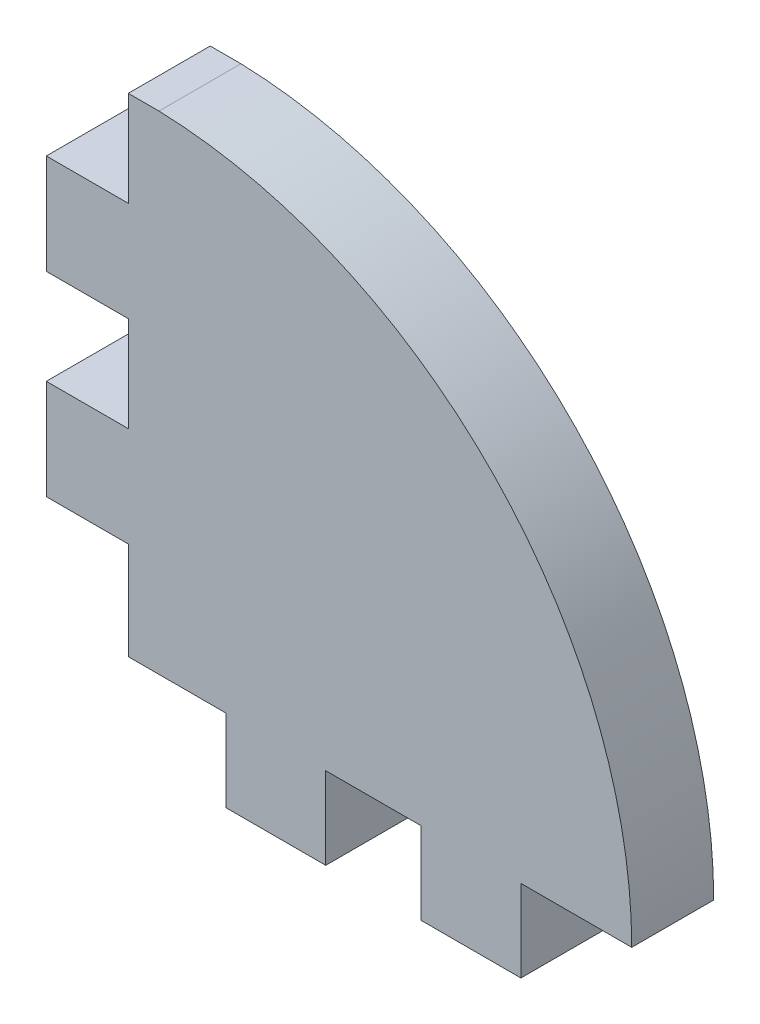
ISO-10303-21;
HEADER;
FILE_DESCRIPTION(('STEP AP214'),'2;1');
FILE_NAME('part.step','',(''),(''),'','','');
FILE_SCHEMA(('AUTOMOTIVE_DESIGN { 1 0 10303 214 1 1 1 1 }'));
ENDSEC;
DATA;
#1=APPLICATION_CONTEXT('core data for automotive mechanical design processes');
#2=APPLICATION_PROTOCOL_DEFINITION('international standard','automotive_design',2000,#1);
#3=PRODUCT_CONTEXT('',#1,'mechanical');
#4=PRODUCT('Part','Part','',(#3));
#5=PRODUCT_RELATED_PRODUCT_CATEGORY('part','',(#4));
#6=PRODUCT_DEFINITION_FORMATION('','',#4);
#7=PRODUCT_DEFINITION_CONTEXT('part definition',#1,'design');
#8=PRODUCT_DEFINITION('design','',#6,#7);
#9=PRODUCT_DEFINITION_SHAPE('','',#8);
#10=(LENGTH_UNIT() NAMED_UNIT(*) SI_UNIT(.MILLI.,.METRE.));
#11=(NAMED_UNIT(*) PLANE_ANGLE_UNIT() SI_UNIT($,.RADIAN.));
#12=(NAMED_UNIT(*) SI_UNIT($,.STERADIAN.) SOLID_ANGLE_UNIT());
#13=UNCERTAINTY_MEASURE_WITH_UNIT(LENGTH_MEASURE(1.E-05),#10,'distance_accuracy_value','');
#14=(GEOMETRIC_REPRESENTATION_CONTEXT(3) GLOBAL_UNCERTAINTY_ASSIGNED_CONTEXT((#13)) GLOBAL_UNIT_ASSIGNED_CONTEXT((#10,
#11,#12)) REPRESENTATION_CONTEXT('',''));
#15=CARTESIAN_POINT('',(0.,0.,0.));
#16=DIRECTION('',(0.,0.,1.));
#17=DIRECTION('',(1.,0.,0.));
#18=AXIS2_PLACEMENT_3D('',#15,#16,#17);
#19=CARTESIAN_POINT('',(0.,0.,-5.334));
#20=DIRECTION('',(0.,0.,1.));
#21=DIRECTION('',(1.,0.,0.));
#22=AXIS2_PLACEMENT_3D('',#19,#20,#21);
#23=PLANE('',#22);
#24=DIRECTION('',(0.,1.,0.));
#25=VECTOR('',#24,1.);
#26=CARTESIAN_POINT('',(30.8864,0.,-5.334));
#27=LINE('',#26,#25);
#28=CARTESIAN_POINT('',(30.8864,-5.334,-5.334));
#29=VERTEX_POINT('',#28);
#30=CARTESIAN_POINT('',(30.8864,0.,-5.334));
#31=VERTEX_POINT('',#30);
#32=EDGE_CURVE('E174',#29,#31,#27,.T.);
#33=ORIENTED_EDGE('',*,*,#32,.F.);
#34=DIRECTION('',(1.,0.,0.));
#35=VECTOR('',#34,1.);
#36=CARTESIAN_POINT('',(0.,-5.334,-5.334));
#37=LINE('',#36,#35);
#38=CARTESIAN_POINT('',(24.384,-5.334,-5.334));
#39=VERTEX_POINT('',#38);
#40=EDGE_CURVE('E186',#39,#29,#37,.T.);
#41=ORIENTED_EDGE('',*,*,#40,.F.);
#42=DIRECTION('',(0.,1.,0.));
#43=VECTOR('',#42,1.);
#44=CARTESIAN_POINT('',(24.384,0.,-5.334));
#45=LINE('',#44,#43);
#46=CARTESIAN_POINT('',(24.384,0.,-5.334));
#47=VERTEX_POINT('',#46);
#48=EDGE_CURVE('E61',#39,#47,#45,.T.);
#49=ORIENTED_EDGE('',*,*,#48,.T.);
#50=DIRECTION('',(-1.,0.,0.));
#51=VECTOR('',#50,1.);
#52=CARTESIAN_POINT('',(0.,0.,-5.334));
#53=LINE('',#52,#51);
#54=CARTESIAN_POINT('',(18.1864,0.,-5.334));
#55=VERTEX_POINT('',#54);
#56=EDGE_CURVE('E243',#47,#55,#53,.T.);
#57=ORIENTED_EDGE('',*,*,#56,.T.);
#58=DIRECTION('',(0.,1.,0.));
#59=VECTOR('',#58,1.);
#60=CARTESIAN_POINT('',(18.1864,0.,-5.334));
#61=LINE('',#60,#59);
#62=CARTESIAN_POINT('',(18.1864,-5.334,-5.334));
#63=VERTEX_POINT('',#62);
#64=EDGE_CURVE('E229',#63,#55,#61,.T.);
#65=ORIENTED_EDGE('',*,*,#64,.F.);
#66=CARTESIAN_POINT('',(11.684,-5.334,-5.334));
#67=VERTEX_POINT('',#66);
#68=EDGE_CURVE('E192',#67,#63,#37,.T.);
#69=ORIENTED_EDGE('',*,*,#68,.F.);
#70=DIRECTION('',(0.,1.,0.));
#71=VECTOR('',#70,1.);
#72=CARTESIAN_POINT('',(11.684,0.,-5.334));
#73=LINE('',#72,#71);
#74=CARTESIAN_POINT('',(11.684,0.,-5.334));
#75=VERTEX_POINT('',#74);
#76=EDGE_CURVE('E244',#67,#75,#73,.T.);
#77=ORIENTED_EDGE('',*,*,#76,.T.);
#78=DIRECTION('',(1.,0.,0.));
#79=VECTOR('',#78,1.);
#80=CARTESIAN_POINT('',(0.,0.,-5.334));
#81=LINE('',#80,#79);
#82=CARTESIAN_POINT('',(5.334,0.,-5.334));
#83=VERTEX_POINT('',#82);
#84=EDGE_CURVE('E247',#83,#75,#81,.T.);
#85=ORIENTED_EDGE('',*,*,#84,.F.);
#86=DIRECTION('',(0.,-1.,0.));
#87=VECTOR('',#86,1.);
#88=CARTESIAN_POINT('',(5.33400000000028,0.,-5.334));
#89=LINE('',#88,#87);
#90=CARTESIAN_POINT('',(5.33400000000028,6.34999999999999,-5.334));
#91=VERTEX_POINT('',#90);
#92=EDGE_CURVE('E250',#91,#83,#89,.T.);
#93=ORIENTED_EDGE('',*,*,#92,.F.);
#94=DIRECTION('',(1.,0.,0.));
#95=VECTOR('',#94,1.);
#96=CARTESIAN_POINT('',(0.,6.34999999999999,-5.334));
#97=LINE('',#96,#95);
#98=CARTESIAN_POINT('',(0.,6.34999999999999,-5.334));
#99=VERTEX_POINT('',#98);
#100=EDGE_CURVE('E252',#99,#91,#97,.T.);
#101=ORIENTED_EDGE('',*,*,#100,.F.);
#102=DIRECTION('',(0.,1.,0.));
#103=VECTOR('',#102,1.);
#104=CARTESIAN_POINT('',(0.,0.,-5.334));
#105=LINE('',#104,#103);
#106=CARTESIAN_POINT('',(0.,12.8524,-5.334));
#107=VERTEX_POINT('',#106);
#108=EDGE_CURVE('E193',#99,#107,#105,.T.);
#109=ORIENTED_EDGE('',*,*,#108,.T.);
#110=DIRECTION('',(1.,0.,0.));
#111=VECTOR('',#110,1.);
#112=CARTESIAN_POINT('',(0.,12.8524,-5.334));
#113=LINE('',#112,#111);
#114=CARTESIAN_POINT('',(5.33400000000014,12.8524,-5.334));
#115=VERTEX_POINT('',#114);
#116=EDGE_CURVE('E276',#107,#115,#113,.T.);
#117=ORIENTED_EDGE('',*,*,#116,.T.);
#118=DIRECTION('',(0.,-1.,0.));
#119=VECTOR('',#118,1.);
#120=CARTESIAN_POINT('',(5.33400000000014,0.,-5.334));
#121=LINE('',#120,#119);
#122=CARTESIAN_POINT('',(5.33400000000014,19.05,-5.334));
#123=VERTEX_POINT('',#122);
#124=EDGE_CURVE('E279',#123,#115,#121,.T.);
#125=ORIENTED_EDGE('',*,*,#124,.F.);
#126=DIRECTION('',(1.,0.,0.));
#127=VECTOR('',#126,1.);
#128=CARTESIAN_POINT('',(0.,19.05,-5.334));
#129=LINE('',#128,#127);
#130=CARTESIAN_POINT('',(0.,19.05,-5.334));
#131=VERTEX_POINT('',#130);
#132=EDGE_CURVE('E282',#131,#123,#129,.T.);
#133=ORIENTED_EDGE('',*,*,#132,.F.);
#134=CARTESIAN_POINT('',(0.,25.5524,-5.334));
#135=VERTEX_POINT('',#134);
#136=EDGE_CURVE('E196',#131,#135,#105,.T.);
#137=ORIENTED_EDGE('',*,*,#136,.T.);
#138=DIRECTION('',(1.,0.,0.));
#139=VECTOR('',#138,1.);
#140=CARTESIAN_POINT('',(0.,25.5524,-5.334));
#141=LINE('',#140,#139);
#142=CARTESIAN_POINT('',(5.334,25.5524,-5.334));
#143=VERTEX_POINT('',#142);
#144=EDGE_CURVE('E304',#135,#143,#141,.T.);
#145=ORIENTED_EDGE('',*,*,#144,.T.);
#146=DIRECTION('',(0.,-1.,0.));
#147=VECTOR('',#146,1.);
#148=CARTESIAN_POINT('',(5.334,0.,-5.334));
#149=LINE('',#148,#147);
#150=CARTESIAN_POINT('',(5.334,31.75,-5.334));
#151=VERTEX_POINT('',#150);
#152=EDGE_CURVE('E302',#151,#143,#149,.T.);
#153=ORIENTED_EDGE('',*,*,#152,.F.);
#154=DIRECTION('',(1.,0.,0.));
#155=VECTOR('',#154,1.);
#156=CARTESIAN_POINT('',(0.,31.75,-5.334));
#157=LINE('',#156,#155);
#158=CARTESIAN_POINT('',(7.33449612403084,31.75,-5.334));
#159=VERTEX_POINT('',#158);
#160=EDGE_CURVE('E217',#151,#159,#157,.T.);
#161=ORIENTED_EDGE('',*,*,#160,.T.);
#162=CARTESIAN_POINT('',(6.33424806201552,0.,-5.334));
#163=DIRECTION('',(0.,0.,1.));
#164=DIRECTION('',(1.,0.,0.));
#165=AXIS2_PLACEMENT_3D('',#162,#163,#164);
#166=CIRCLE('',#165,31.7657519379845);
#167=CARTESIAN_POINT('',(38.1,0.,-5.334));
#168=VERTEX_POINT('',#167);
#169=EDGE_CURVE('E212',#159,#168,#166,.F.);
#170=ORIENTED_EDGE('',*,*,#169,.T.);
#171=DIRECTION('',(-1.,0.,0.));
#172=VECTOR('',#171,1.);
#173=CARTESIAN_POINT('',(0.,0.,-5.334));
#174=LINE('',#173,#172);
#175=EDGE_CURVE('E181',#168,#31,#174,.T.);
#176=ORIENTED_EDGE('',*,*,#175,.T.);
#177=EDGE_LOOP('',(#33,#41,#49,#57,#65,#69,#77,#85,#93,#101,#109,#117,#125,#133,#137,#145,#153,
#161,#170,#176));
#178=FACE_BOUND('',#177,.T.);
#179=ADVANCED_FACE('F38',(#178),#23,.F.);
#180=CARTESIAN_POINT('',(0.,0.,0.));
#181=DIRECTION('',(0.,0.,1.));
#182=DIRECTION('',(1.,0.,0.));
#183=AXIS2_PLACEMENT_3D('',#180,#181,#182);
#184=PLANE('',#183);
#185=DIRECTION('',(1.,0.,0.));
#186=VECTOR('',#185,1.);
#187=CARTESIAN_POINT('',(0.,-5.334,0.));
#188=LINE('',#187,#186);
#189=CARTESIAN_POINT('',(24.384,-5.334,0.));
#190=VERTEX_POINT('',#189);
#191=CARTESIAN_POINT('',(30.8864,-5.334,0.));
#192=VERTEX_POINT('',#191);
#193=EDGE_CURVE('E209',#190,#192,#188,.T.);
#194=ORIENTED_EDGE('',*,*,#193,.T.);
#195=DIRECTION('',(0.,1.,0.));
#196=VECTOR('',#195,1.);
#197=CARTESIAN_POINT('',(30.8864,0.,0.));
#198=LINE('',#197,#196);
#199=CARTESIAN_POINT('',(30.8864,0.,0.));
#200=VERTEX_POINT('',#199);
#201=EDGE_CURVE('E53',#192,#200,#198,.T.);
#202=ORIENTED_EDGE('',*,*,#201,.T.);
#203=DIRECTION('',(-1.,0.,0.));
#204=VECTOR('',#203,1.);
#205=CARTESIAN_POINT('',(0.,0.,0.));
#206=LINE('',#205,#204);
#207=CARTESIAN_POINT('',(38.1,0.,0.));
#208=VERTEX_POINT('',#207);
#209=EDGE_CURVE('E188',#208,#200,#206,.T.);
#210=ORIENTED_EDGE('',*,*,#209,.F.);
#211=CARTESIAN_POINT('',(6.33424806201552,0.,0.));
#212=DIRECTION('',(0.,0.,1.));
#213=DIRECTION('',(1.,0.,0.));
#214=AXIS2_PLACEMENT_3D('',#211,#212,#213);
#215=CIRCLE('',#214,31.7657519379845);
#216=CARTESIAN_POINT('',(7.33449612403084,31.75,0.));
#217=VERTEX_POINT('',#216);
#218=EDGE_CURVE('E200',#217,#208,#215,.F.);
#219=ORIENTED_EDGE('',*,*,#218,.F.);
#220=DIRECTION('',(1.,0.,0.));
#221=VECTOR('',#220,1.);
#222=CARTESIAN_POINT('',(0.,31.75,0.));
#223=LINE('',#222,#221);
#224=CARTESIAN_POINT('',(5.334,31.75,0.));
#225=VERTEX_POINT('',#224);
#226=EDGE_CURVE('E203',#225,#217,#223,.T.);
#227=ORIENTED_EDGE('',*,*,#226,.F.);
#228=DIRECTION('',(0.,-1.,0.));
#229=VECTOR('',#228,1.);
#230=CARTESIAN_POINT('',(5.334,0.,0.));
#231=LINE('',#230,#229);
#232=CARTESIAN_POINT('',(5.334,25.5524,0.));
#233=VERTEX_POINT('',#232);
#234=EDGE_CURVE('E295',#225,#233,#231,.T.);
#235=ORIENTED_EDGE('',*,*,#234,.T.);
#236=DIRECTION('',(1.,0.,0.));
#237=VECTOR('',#236,1.);
#238=CARTESIAN_POINT('',(0.,25.5524,0.));
#239=LINE('',#238,#237);
#240=CARTESIAN_POINT('',(0.,25.5524,0.));
#241=VERTEX_POINT('',#240);
#242=EDGE_CURVE('E305',#241,#233,#239,.T.);
#243=ORIENTED_EDGE('',*,*,#242,.F.);
#244=DIRECTION('',(0.,1.,0.));
#245=VECTOR('',#244,1.);
#246=CARTESIAN_POINT('',(0.,0.,0.));
#247=LINE('',#246,#245);
#248=CARTESIAN_POINT('',(0.,19.05,0.));
#249=VERTEX_POINT('',#248);
#250=EDGE_CURVE('E206',#249,#241,#247,.T.);
#251=ORIENTED_EDGE('',*,*,#250,.F.);
#252=DIRECTION('',(1.,0.,0.));
#253=VECTOR('',#252,1.);
#254=CARTESIAN_POINT('',(0.,19.05,0.));
#255=LINE('',#254,#253);
#256=CARTESIAN_POINT('',(5.33400000000014,19.05,0.));
#257=VERTEX_POINT('',#256);
#258=EDGE_CURVE('E280',#249,#257,#255,.T.);
#259=ORIENTED_EDGE('',*,*,#258,.T.);
#260=DIRECTION('',(0.,-1.,0.));
#261=VECTOR('',#260,1.);
#262=CARTESIAN_POINT('',(5.33400000000014,0.,0.));
#263=LINE('',#262,#261);
#264=CARTESIAN_POINT('',(5.33400000000014,12.8524,0.));
#265=VERTEX_POINT('',#264);
#266=EDGE_CURVE('E287',#257,#265,#263,.T.);
#267=ORIENTED_EDGE('',*,*,#266,.T.);
#268=DIRECTION('',(1.,0.,0.));
#269=VECTOR('',#268,1.);
#270=CARTESIAN_POINT('',(0.,12.8524,0.));
#271=LINE('',#270,#269);
#272=CARTESIAN_POINT('',(0.,12.8524,0.));
#273=VERTEX_POINT('',#272);
#274=EDGE_CURVE('E268',#273,#265,#271,.T.);
#275=ORIENTED_EDGE('',*,*,#274,.F.);
#276=CARTESIAN_POINT('',(0.,6.34999999999999,0.));
#277=VERTEX_POINT('',#276);
#278=EDGE_CURVE('E207',#277,#273,#247,.T.);
#279=ORIENTED_EDGE('',*,*,#278,.F.);
#280=DIRECTION('',(1.,0.,0.));
#281=VECTOR('',#280,1.);
#282=CARTESIAN_POINT('',(0.,6.34999999999999,0.));
#283=LINE('',#282,#281);
#284=CARTESIAN_POINT('',(5.33400000000028,6.34999999999999,0.));
#285=VERTEX_POINT('',#284);
#286=EDGE_CURVE('E248',#277,#285,#283,.T.);
#287=ORIENTED_EDGE('',*,*,#286,.T.);
#288=DIRECTION('',(0.,-1.,0.));
#289=VECTOR('',#288,1.);
#290=CARTESIAN_POINT('',(5.33400000000028,0.,0.));
#291=LINE('',#290,#289);
#292=CARTESIAN_POINT('',(5.334,0.,0.));
#293=VERTEX_POINT('',#292);
#294=EDGE_CURVE('E260',#285,#293,#291,.T.);
#295=ORIENTED_EDGE('',*,*,#294,.T.);
#296=DIRECTION('',(1.,0.,0.));
#297=VECTOR('',#296,1.);
#298=CARTESIAN_POINT('',(0.,0.,0.));
#299=LINE('',#298,#297);
#300=CARTESIAN_POINT('',(11.684,0.,0.));
#301=VERTEX_POINT('',#300);
#302=EDGE_CURVE('E257',#293,#301,#299,.T.);
#303=ORIENTED_EDGE('',*,*,#302,.T.);
#304=DIRECTION('',(0.,1.,0.));
#305=VECTOR('',#304,1.);
#306=CARTESIAN_POINT('',(11.684,0.,0.));
#307=LINE('',#306,#305);
#308=CARTESIAN_POINT('',(11.684,-5.334,0.));
#309=VERTEX_POINT('',#308);
#310=EDGE_CURVE('E236',#309,#301,#307,.T.);
#311=ORIENTED_EDGE('',*,*,#310,.F.);
#312=CARTESIAN_POINT('',(18.1864,-5.334,0.));
#313=VERTEX_POINT('',#312);
#314=EDGE_CURVE('E210',#309,#313,#188,.T.);
#315=ORIENTED_EDGE('',*,*,#314,.T.);
#316=DIRECTION('',(0.,1.,0.));
#317=VECTOR('',#316,1.);
#318=CARTESIAN_POINT('',(18.1864,0.,0.));
#319=LINE('',#318,#317);
#320=CARTESIAN_POINT('',(18.1864,0.,0.));
#321=VERTEX_POINT('',#320);
#322=EDGE_CURVE('E227',#313,#321,#319,.T.);
#323=ORIENTED_EDGE('',*,*,#322,.T.);
#324=DIRECTION('',(-1.,0.,0.));
#325=VECTOR('',#324,1.);
#326=CARTESIAN_POINT('',(0.,0.,0.));
#327=LINE('',#326,#325);
#328=CARTESIAN_POINT('',(24.384,0.,0.));
#329=VERTEX_POINT('',#328);
#330=EDGE_CURVE('E226',#329,#321,#327,.T.);
#331=ORIENTED_EDGE('',*,*,#330,.F.);
#332=DIRECTION('',(0.,1.,0.));
#333=VECTOR('',#332,1.);
#334=CARTESIAN_POINT('',(24.384,0.,0.));
#335=LINE('',#334,#333);
#336=EDGE_CURVE('E224',#190,#329,#335,.T.);
#337=ORIENTED_EDGE('',*,*,#336,.F.);
#338=EDGE_LOOP('',(#194,#202,#210,#219,#227,#235,#243,#251,#259,#267,#275,#279,#287,#295,#303,
#311,#315,#323,#331,#337));
#339=FACE_BOUND('',#338,.T.);
#340=ADVANCED_FACE('F220',(#339),#184,.T.);
#341=CARTESIAN_POINT('',(0.,-5.334,-5.334));
#342=DIRECTION('',(0.,-1.,0.));
#343=DIRECTION('',(0.,0.,-1.));
#344=AXIS2_PLACEMENT_3D('',#341,#342,#343);
#345=PLANE('',#344);
#346=ORIENTED_EDGE('',*,*,#40,.T.);
#347=DIRECTION('',(0.,0.,1.));
#348=VECTOR('',#347,1.);
#349=CARTESIAN_POINT('',(30.8864,-5.334,-5.334));
#350=LINE('',#349,#348);
#351=EDGE_CURVE('E171',#29,#192,#350,.T.);
#352=ORIENTED_EDGE('',*,*,#351,.T.);
#353=ORIENTED_EDGE('',*,*,#193,.F.);
#354=DIRECTION('',(0.,0.,1.));
#355=VECTOR('',#354,1.);
#356=CARTESIAN_POINT('',(24.384,-5.334,-5.334));
#357=LINE('',#356,#355);
#358=EDGE_CURVE('E191',#39,#190,#357,.T.);
#359=ORIENTED_EDGE('',*,*,#358,.F.);
#360=EDGE_LOOP('',(#346,#352,#353,#359));
#361=FACE_BOUND('',#360,.T.);
#362=ADVANCED_FACE('F190',(#361),#345,.T.);
#363=ORIENTED_EDGE('',*,*,#68,.T.);
#364=DIRECTION('',(0.,0.,1.));
#365=VECTOR('',#364,1.);
#366=CARTESIAN_POINT('',(18.1864,-5.334,-5.334));
#367=LINE('',#366,#365);
#368=EDGE_CURVE('E240',#63,#313,#367,.T.);
#369=ORIENTED_EDGE('',*,*,#368,.T.);
#370=ORIENTED_EDGE('',*,*,#314,.F.);
#371=DIRECTION('',(0.,0.,1.));
#372=VECTOR('',#371,1.);
#373=CARTESIAN_POINT('',(11.684,-5.334,-5.334));
#374=LINE('',#373,#372);
#375=EDGE_CURVE('E254',#67,#309,#374,.T.);
#376=ORIENTED_EDGE('',*,*,#375,.F.);
#377=EDGE_LOOP('',(#363,#369,#370,#376));
#378=FACE_BOUND('',#377,.T.);
#379=ADVANCED_FACE('F362',(#378),#345,.T.);
#380=CARTESIAN_POINT('',(0.,0.,-5.334));
#381=DIRECTION('',(1.,0.,0.));
#382=DIRECTION('',(0.,1.,0.));
#383=AXIS2_PLACEMENT_3D('',#380,#381,#382);
#384=PLANE('',#383);
#385=DIRECTION('',(0.,0.,1.));
#386=VECTOR('',#385,1.);
#387=CARTESIAN_POINT('',(0.,6.34999999999999,-5.334));
#388=LINE('',#387,#386);
#389=EDGE_CURVE('E265',#99,#277,#388,.T.);
#390=ORIENTED_EDGE('',*,*,#389,.T.);
#391=ORIENTED_EDGE('',*,*,#278,.T.);
#392=DIRECTION('',(0.,0.,1.));
#393=VECTOR('',#392,1.);
#394=CARTESIAN_POINT('',(0.,12.8524,-5.334));
#395=LINE('',#394,#393);
#396=EDGE_CURVE('E284',#107,#273,#395,.T.);
#397=ORIENTED_EDGE('',*,*,#396,.F.);
#398=ORIENTED_EDGE('',*,*,#108,.F.);
#399=EDGE_LOOP('',(#390,#391,#397,#398));
#400=FACE_BOUND('',#399,.T.);
#401=ADVANCED_FACE('F383',(#400),#384,.F.);
#402=DIRECTION('',(0.,0.,1.));
#403=VECTOR('',#402,1.);
#404=CARTESIAN_POINT('',(0.,19.05,-5.334));
#405=LINE('',#404,#403);
#406=EDGE_CURVE('E292',#131,#249,#405,.T.);
#407=ORIENTED_EDGE('',*,*,#406,.T.);
#408=ORIENTED_EDGE('',*,*,#250,.T.);
#409=DIRECTION('',(0.,0.,1.));
#410=VECTOR('',#409,1.);
#411=CARTESIAN_POINT('',(0.,25.5524,-5.334));
#412=LINE('',#411,#410);
#413=EDGE_CURVE('E314',#135,#241,#412,.T.);
#414=ORIENTED_EDGE('',*,*,#413,.F.);
#415=ORIENTED_EDGE('',*,*,#136,.F.);
#416=EDGE_LOOP('',(#407,#408,#414,#415));
#417=FACE_BOUND('',#416,.T.);
#418=ADVANCED_FACE('F331',(#417),#384,.F.);
#419=CARTESIAN_POINT('',(0.,31.75,-5.334));
#420=DIRECTION('',(0.,-1.,0.));
#421=DIRECTION('',(0.,0.,-1.));
#422=AXIS2_PLACEMENT_3D('',#419,#420,#421);
#423=PLANE('',#422);
#424=DIRECTION('',(0.,0.,1.));
#425=VECTOR('',#424,1.);
#426=CARTESIAN_POINT('',(5.334,31.75,-5.334));
#427=LINE('',#426,#425);
#428=EDGE_CURVE('E308',#151,#225,#427,.T.);
#429=ORIENTED_EDGE('',*,*,#428,.T.);
#430=ORIENTED_EDGE('',*,*,#226,.T.);
#431=DIRECTION('',(0.,0.,1.));
#432=VECTOR('',#431,1.);
#433=CARTESIAN_POINT('',(7.33449612403084,31.75,-5.334));
#434=LINE('',#433,#432);
#435=EDGE_CURVE('E42',#159,#217,#434,.T.);
#436=ORIENTED_EDGE('',*,*,#435,.F.);
#437=ORIENTED_EDGE('',*,*,#160,.F.);
#438=EDGE_LOOP('',(#429,#430,#436,#437));
#439=FACE_BOUND('',#438,.T.);
#440=ADVANCED_FACE('F338',(#439),#423,.F.);
#441=CARTESIAN_POINT('',(6.33424806201552,0.,-5.334));
#442=DIRECTION('',(0.,0.,1.));
#443=DIRECTION('',(1.,0.,0.));
#444=AXIS2_PLACEMENT_3D('',#441,#442,#443);
#445=CYLINDRICAL_SURFACE('',#444,31.7657519379845);
#446=ORIENTED_EDGE('',*,*,#218,.T.);
#447=DIRECTION('',(0.,0.,1.));
#448=VECTOR('',#447,1.);
#449=CARTESIAN_POINT('',(38.1,0.,-5.334));
#450=LINE('',#449,#448);
#451=EDGE_CURVE('E11',#168,#208,#450,.T.);
#452=ORIENTED_EDGE('',*,*,#451,.F.);
#453=ORIENTED_EDGE('',*,*,#169,.F.);
#454=ORIENTED_EDGE('',*,*,#435,.T.);
#455=EDGE_LOOP('',(#446,#452,#453,#454));
#456=FACE_BOUND('',#455,.T.);
#457=ADVANCED_FACE('F40',(#456),#445,.T.);
#458=CARTESIAN_POINT('',(5.334,0.,-5.334));
#459=DIRECTION('',(-1.,0.,0.));
#460=DIRECTION('',(0.,-1.,0.));
#461=AXIS2_PLACEMENT_3D('',#458,#459,#460);
#462=PLANE('',#461);
#463=ORIENTED_EDGE('',*,*,#234,.F.);
#464=ORIENTED_EDGE('',*,*,#428,.F.);
#465=ORIENTED_EDGE('',*,*,#152,.T.);
#466=DIRECTION('',(0.,0.,1.));
#467=VECTOR('',#466,1.);
#468=CARTESIAN_POINT('',(5.334,25.5524,-5.334));
#469=LINE('',#468,#467);
#470=EDGE_CURVE('E204',#143,#233,#469,.T.);
#471=ORIENTED_EDGE('',*,*,#470,.T.);
#472=EDGE_LOOP('',(#463,#464,#465,#471));
#473=FACE_BOUND('',#472,.T.);
#474=ADVANCED_FACE('F336',(#473),#462,.T.);
#475=CARTESIAN_POINT('',(0.,25.5524,-5.334));
#476=DIRECTION('',(0.,-1.,0.));
#477=DIRECTION('',(0.,0.,-1.));
#478=AXIS2_PLACEMENT_3D('',#475,#476,#477);
#479=PLANE('',#478);
#480=ORIENTED_EDGE('',*,*,#242,.T.);
#481=ORIENTED_EDGE('',*,*,#470,.F.);
#482=ORIENTED_EDGE('',*,*,#144,.F.);
#483=ORIENTED_EDGE('',*,*,#413,.T.);
#484=EDGE_LOOP('',(#480,#481,#482,#483));
#485=FACE_BOUND('',#484,.T.);
#486=ADVANCED_FACE('F329',(#485),#479,.F.);
#487=CARTESIAN_POINT('',(0.,19.05,-5.334));
#488=DIRECTION('',(0.,-1.,0.));
#489=DIRECTION('',(0.,0.,-1.));
#490=AXIS2_PLACEMENT_3D('',#487,#488,#489);
#491=PLANE('',#490);
#492=ORIENTED_EDGE('',*,*,#258,.F.);
#493=ORIENTED_EDGE('',*,*,#406,.F.);
#494=ORIENTED_EDGE('',*,*,#132,.T.);
#495=DIRECTION('',(0.,0.,1.));
#496=VECTOR('',#495,1.);
#497=CARTESIAN_POINT('',(5.33400000000014,19.05,-5.334));
#498=LINE('',#497,#496);
#499=EDGE_CURVE('E296',#123,#257,#498,.T.);
#500=ORIENTED_EDGE('',*,*,#499,.T.);
#501=EDGE_LOOP('',(#492,#493,#494,#500));
#502=FACE_BOUND('',#501,.T.);
#503=ADVANCED_FACE('F394',(#502),#491,.T.);
#504=CARTESIAN_POINT('',(5.33400000000014,0.,-5.334));
#505=DIRECTION('',(-1.,0.,0.));
#506=DIRECTION('',(0.,-1.,0.));
#507=AXIS2_PLACEMENT_3D('',#504,#505,#506);
#508=PLANE('',#507);
#509=ORIENTED_EDGE('',*,*,#266,.F.);
#510=ORIENTED_EDGE('',*,*,#499,.F.);
#511=ORIENTED_EDGE('',*,*,#124,.T.);
#512=DIRECTION('',(0.,0.,1.));
#513=VECTOR('',#512,1.);
#514=CARTESIAN_POINT('',(5.33400000000014,12.8524,-5.334));
#515=LINE('',#514,#513);
#516=EDGE_CURVE('E298',#115,#265,#515,.T.);
#517=ORIENTED_EDGE('',*,*,#516,.T.);
#518=EDGE_LOOP('',(#509,#510,#511,#517));
#519=FACE_BOUND('',#518,.T.);
#520=ADVANCED_FACE('F392',(#519),#508,.T.);
#521=CARTESIAN_POINT('',(0.,12.8524,-5.334));
#522=DIRECTION('',(0.,-1.,0.));
#523=DIRECTION('',(0.,0.,-1.));
#524=AXIS2_PLACEMENT_3D('',#521,#522,#523);
#525=PLANE('',#524);
#526=ORIENTED_EDGE('',*,*,#274,.T.);
#527=ORIENTED_EDGE('',*,*,#516,.F.);
#528=ORIENTED_EDGE('',*,*,#116,.F.);
#529=ORIENTED_EDGE('',*,*,#396,.T.);
#530=EDGE_LOOP('',(#526,#527,#528,#529));
#531=FACE_BOUND('',#530,.T.);
#532=ADVANCED_FACE('F387',(#531),#525,.F.);
#533=CARTESIAN_POINT('',(0.,6.34999999999999,-5.334));
#534=DIRECTION('',(0.,-1.,0.));
#535=DIRECTION('',(0.,0.,-1.));
#536=AXIS2_PLACEMENT_3D('',#533,#534,#535);
#537=PLANE('',#536);
#538=ORIENTED_EDGE('',*,*,#286,.F.);
#539=ORIENTED_EDGE('',*,*,#389,.F.);
#540=ORIENTED_EDGE('',*,*,#100,.T.);
#541=DIRECTION('',(0.,0.,1.));
#542=VECTOR('',#541,1.);
#543=CARTESIAN_POINT('',(5.33400000000028,6.34999999999999,-5.334));
#544=LINE('',#543,#542);
#545=EDGE_CURVE('E269',#91,#285,#544,.T.);
#546=ORIENTED_EDGE('',*,*,#545,.T.);
#547=EDGE_LOOP('',(#538,#539,#540,#546));
#548=FACE_BOUND('',#547,.T.);
#549=ADVANCED_FACE('F463',(#548),#537,.T.);
#550=CARTESIAN_POINT('',(5.33400000000028,0.,-5.334));
#551=DIRECTION('',(-1.,0.,0.));
#552=DIRECTION('',(0.,-1.,0.));
#553=AXIS2_PLACEMENT_3D('',#550,#551,#552);
#554=PLANE('',#553);
#555=ORIENTED_EDGE('',*,*,#294,.F.);
#556=ORIENTED_EDGE('',*,*,#545,.F.);
#557=ORIENTED_EDGE('',*,*,#92,.T.);
#558=DIRECTION('',(0.,0.,1.));
#559=VECTOR('',#558,1.);
#560=CARTESIAN_POINT('',(5.334,0.,-5.334));
#561=LINE('',#560,#559);
#562=EDGE_CURVE('E271',#83,#293,#561,.T.);
#563=ORIENTED_EDGE('',*,*,#562,.T.);
#564=EDGE_LOOP('',(#555,#556,#557,#563));
#565=FACE_BOUND('',#564,.T.);
#566=ADVANCED_FACE('F375',(#565),#554,.T.);
#567=CARTESIAN_POINT('',(0.,0.,-5.334));
#568=DIRECTION('',(0.,-1.,0.));
#569=DIRECTION('',(1.,0.,0.));
#570=AXIS2_PLACEMENT_3D('',#567,#568,#569);
#571=PLANE('',#570);
#572=ORIENTED_EDGE('',*,*,#302,.F.);
#573=ORIENTED_EDGE('',*,*,#562,.F.);
#574=ORIENTED_EDGE('',*,*,#84,.T.);
#575=DIRECTION('',(0.,0.,1.));
#576=VECTOR('',#575,1.);
#577=CARTESIAN_POINT('',(11.684,0.,-5.334));
#578=LINE('',#577,#576);
#579=EDGE_CURVE('E273',#75,#301,#578,.T.);
#580=ORIENTED_EDGE('',*,*,#579,.T.);
#581=EDGE_LOOP('',(#572,#573,#574,#580));
#582=FACE_BOUND('',#581,.T.);
#583=ADVANCED_FACE('F371',(#582),#571,.T.);
#584=CARTESIAN_POINT('',(11.684,0.,-5.334));
#585=DIRECTION('',(1.,0.,0.));
#586=DIRECTION('',(0.,0.,-1.));
#587=AXIS2_PLACEMENT_3D('',#584,#585,#586);
#588=PLANE('',#587);
#589=ORIENTED_EDGE('',*,*,#310,.T.);
#590=ORIENTED_EDGE('',*,*,#579,.F.);
#591=ORIENTED_EDGE('',*,*,#76,.F.);
#592=ORIENTED_EDGE('',*,*,#375,.T.);
#593=EDGE_LOOP('',(#589,#590,#591,#592));
#594=FACE_BOUND('',#593,.T.);
#595=ADVANCED_FACE('F368',(#594),#588,.F.);
#596=CARTESIAN_POINT('',(18.1864,0.,-5.334));
#597=DIRECTION('',(1.,0.,0.));
#598=DIRECTION('',(0.,0.,-1.));
#599=AXIS2_PLACEMENT_3D('',#596,#597,#598);
#600=PLANE('',#599);
#601=ORIENTED_EDGE('',*,*,#322,.F.);
#602=ORIENTED_EDGE('',*,*,#368,.F.);
#603=ORIENTED_EDGE('',*,*,#64,.T.);
#604=DIRECTION('',(0.,0.,1.));
#605=VECTOR('',#604,1.);
#606=CARTESIAN_POINT('',(18.1864,0.,-5.334));
#607=LINE('',#606,#605);
#608=EDGE_CURVE('E234',#55,#321,#607,.T.);
#609=ORIENTED_EDGE('',*,*,#608,.T.);
#610=EDGE_LOOP('',(#601,#602,#603,#609));
#611=FACE_BOUND('',#610,.T.);
#612=ADVANCED_FACE('F360',(#611),#600,.T.);
#613=CARTESIAN_POINT('',(0.,0.,-5.334));
#614=DIRECTION('',(0.,1.,0.));
#615=DIRECTION('',(-1.,0.,0.));
#616=AXIS2_PLACEMENT_3D('',#613,#614,#615);
#617=PLANE('',#616);
#618=ORIENTED_EDGE('',*,*,#330,.T.);
#619=ORIENTED_EDGE('',*,*,#608,.F.);
#620=ORIENTED_EDGE('',*,*,#56,.F.);
#621=DIRECTION('',(0.,0.,1.));
#622=VECTOR('',#621,1.);
#623=CARTESIAN_POINT('',(24.384,0.,-5.334));
#624=LINE('',#623,#622);
#625=EDGE_CURVE('E237',#47,#329,#624,.T.);
#626=ORIENTED_EDGE('',*,*,#625,.T.);
#627=EDGE_LOOP('',(#618,#619,#620,#626));
#628=FACE_BOUND('',#627,.T.);
#629=ADVANCED_FACE('F358',(#628),#617,.F.);
#630=CARTESIAN_POINT('',(24.384,0.,-5.334));
#631=DIRECTION('',(1.,0.,0.));
#632=DIRECTION('',(0.,0.,-1.));
#633=AXIS2_PLACEMENT_3D('',#630,#631,#632);
#634=PLANE('',#633);
#635=ORIENTED_EDGE('',*,*,#336,.T.);
#636=ORIENTED_EDGE('',*,*,#625,.F.);
#637=ORIENTED_EDGE('',*,*,#48,.F.);
#638=ORIENTED_EDGE('',*,*,#358,.T.);
#639=EDGE_LOOP('',(#635,#636,#637,#638));
#640=FACE_BOUND('',#639,.T.);
#641=ADVANCED_FACE('F505',(#640),#634,.F.);
#642=CARTESIAN_POINT('',(30.8864,0.,-5.334));
#643=DIRECTION('',(1.,0.,0.));
#644=DIRECTION('',(0.,0.,-1.));
#645=AXIS2_PLACEMENT_3D('',#642,#643,#644);
#646=PLANE('',#645);
#647=ORIENTED_EDGE('',*,*,#201,.F.);
#648=ORIENTED_EDGE('',*,*,#351,.F.);
#649=ORIENTED_EDGE('',*,*,#32,.T.);
#650=DIRECTION('',(0.,0.,1.));
#651=VECTOR('',#650,1.);
#652=CARTESIAN_POINT('',(30.8864,0.,-5.334));
#653=LINE('',#652,#651);
#654=EDGE_CURVE('E180',#31,#200,#653,.T.);
#655=ORIENTED_EDGE('',*,*,#654,.T.);
#656=EDGE_LOOP('',(#647,#648,#649,#655));
#657=FACE_BOUND('',#656,.T.);
#658=ADVANCED_FACE('F173',(#657),#646,.T.);
#659=CARTESIAN_POINT('',(0.,0.,-5.334));
#660=DIRECTION('',(0.,1.,0.));
#661=DIRECTION('',(-1.,0.,0.));
#662=AXIS2_PLACEMENT_3D('',#659,#660,#661);
#663=PLANE('',#662);
#664=ORIENTED_EDGE('',*,*,#209,.T.);
#665=ORIENTED_EDGE('',*,*,#654,.F.);
#666=ORIENTED_EDGE('',*,*,#175,.F.);
#667=ORIENTED_EDGE('',*,*,#451,.T.);
#668=EDGE_LOOP('',(#664,#665,#666,#667));
#669=FACE_BOUND('',#668,.T.);
#670=ADVANCED_FACE('F345',(#669),#663,.F.);
#671=CLOSED_SHELL('',(#179,#340,#362,#379,#401,#418,#440,#457,#474,#486,#503,#520,#532,#549,
#566,#583,#595,#612,#629,#641,#658,#670));
#672=MANIFOLD_SOLID_BREP('B2',#671);
#673=ADVANCED_BREP_SHAPE_REPRESENTATION('',(#18,#672),#14);
#674=SHAPE_DEFINITION_REPRESENTATION(#9,#673);
ENDSEC;
END-ISO-10303-21;
